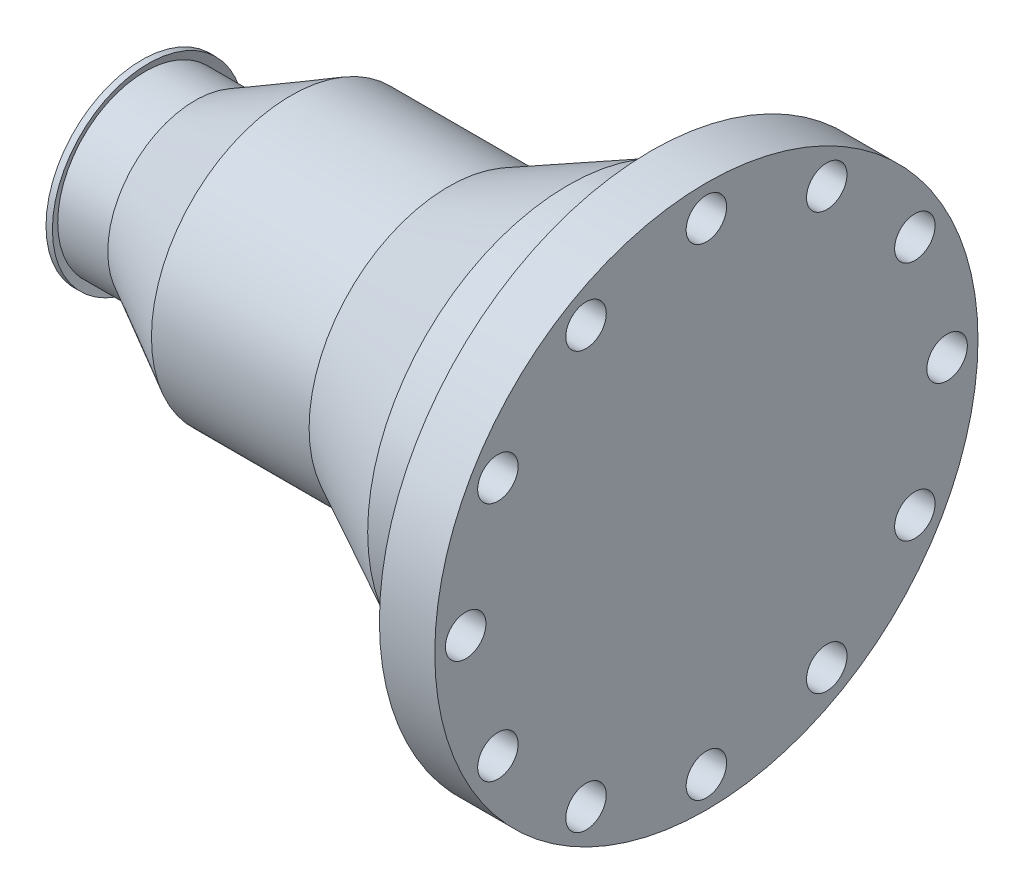
ISO-10303-21;
HEADER;
FILE_DESCRIPTION(('STEP AP214'),'2;1');
FILE_NAME('part.step','',(''),(''),'','','');
FILE_SCHEMA(('AUTOMOTIVE_DESIGN { 1 0 10303 214 1 1 1 1 }'));
ENDSEC;
DATA;
#1=APPLICATION_CONTEXT('core data for automotive mechanical design processes');
#2=APPLICATION_PROTOCOL_DEFINITION('international standard','automotive_design',2000,#1);
#3=PRODUCT_CONTEXT('',#1,'mechanical');
#4=PRODUCT('Part','Part','',(#3));
#5=PRODUCT_RELATED_PRODUCT_CATEGORY('part','',(#4));
#6=PRODUCT_DEFINITION_FORMATION('','',#4);
#7=PRODUCT_DEFINITION_CONTEXT('part definition',#1,'design');
#8=PRODUCT_DEFINITION('design','',#6,#7);
#9=PRODUCT_DEFINITION_SHAPE('','',#8);
#10=(LENGTH_UNIT() NAMED_UNIT(*) SI_UNIT(.MILLI.,.METRE.));
#11=(NAMED_UNIT(*) PLANE_ANGLE_UNIT() SI_UNIT($,.RADIAN.));
#12=(NAMED_UNIT(*) SI_UNIT($,.STERADIAN.) SOLID_ANGLE_UNIT());
#13=UNCERTAINTY_MEASURE_WITH_UNIT(LENGTH_MEASURE(1.E-05),#10,'distance_accuracy_value','');
#14=(GEOMETRIC_REPRESENTATION_CONTEXT(3) GLOBAL_UNCERTAINTY_ASSIGNED_CONTEXT((#13)) GLOBAL_UNIT_ASSIGNED_CONTEXT((#10,
#11,#12)) REPRESENTATION_CONTEXT('',''));
#15=CARTESIAN_POINT('',(0.,0.,0.));
#16=DIRECTION('',(0.,0.,1.));
#17=DIRECTION('',(1.,0.,0.));
#18=AXIS2_PLACEMENT_3D('',#15,#16,#17);
#19=CARTESIAN_POINT('',(0.,0.,0.));
#20=DIRECTION('',(1.,0.,0.));
#21=DIRECTION('',(0.,0.,-1.));
#22=AXIS2_PLACEMENT_3D('',#19,#20,#21);
#23=PLANE('',#22);
#24=CARTESIAN_POINT('',(0.,0.,0.));
#25=DIRECTION('',(-1.,0.,0.));
#26=DIRECTION('',(0.,0.,1.));
#27=AXIS2_PLACEMENT_3D('',#24,#25,#26);
#28=CIRCLE('',#27,31.);
#29=CARTESIAN_POINT('',(0.,0.,31.));
#30=VERTEX_POINT('',#29);
#31=EDGE_CURVE('E80',#30,#30,#28,.T.);
#32=ORIENTED_EDGE('',*,*,#31,.F.);
#33=EDGE_LOOP('',(#32));
#34=FACE_BOUND('',#33,.T.);
#35=CARTESIAN_POINT('',(0.,0.,0.));
#36=DIRECTION('',(-1.,0.,0.));
#37=DIRECTION('',(0.,0.,1.));
#38=AXIS2_PLACEMENT_3D('',#35,#36,#37);
#39=CIRCLE('',#38,45.);
#40=CARTESIAN_POINT('',(0.,0.,45.));
#41=VERTEX_POINT('',#40);
#42=EDGE_CURVE('E10',#41,#41,#39,.T.);
#43=ORIENTED_EDGE('',*,*,#42,.T.);
#44=EDGE_LOOP('',(#43));
#45=FACE_BOUND('',#44,.T.);
#46=ADVANCED_FACE('F37',(#34,#45),#23,.F.);
#47=CARTESIAN_POINT('',(0.,0.,0.));
#48=DIRECTION('',(-1.,0.,0.));
#49=DIRECTION('',(0.,0.,1.));
#50=AXIS2_PLACEMENT_3D('',#47,#48,#49);
#51=CYLINDRICAL_SURFACE('',#50,45.);
#52=ORIENTED_EDGE('',*,*,#42,.F.);
#53=EDGE_LOOP('',(#52));
#54=FACE_BOUND('',#53,.T.);
#55=CARTESIAN_POINT('',(3.,0.,0.));
#56=DIRECTION('',(-1.,0.,0.));
#57=DIRECTION('',(0.,0.,1.));
#58=AXIS2_PLACEMENT_3D('',#55,#56,#57);
#59=CIRCLE('',#58,45.);
#60=CARTESIAN_POINT('',(3.,0.,45.));
#61=VERTEX_POINT('',#60);
#62=EDGE_CURVE('E43',#61,#61,#59,.T.);
#63=ORIENTED_EDGE('',*,*,#62,.T.);
#64=EDGE_LOOP('',(#63));
#65=FACE_BOUND('',#64,.T.);
#66=ADVANCED_FACE('F214',(#54,#65),#51,.T.);
#67=CARTESIAN_POINT('',(1.5,0.,0.));
#68=DIRECTION('',(1.,0.,0.));
#69=DIRECTION('',(0.,0.,-1.));
#70=AXIS2_PLACEMENT_3D('',#67,#68,#69);
#71=CONICAL_SURFACE('',#70,41.,1.21202565652432);
#72=ORIENTED_EDGE('',*,*,#62,.F.);
#73=EDGE_LOOP('',(#72));
#74=FACE_BOUND('',#73,.T.);
#75=CARTESIAN_POINT('',(1.5,0.,0.));
#76=DIRECTION('',(-1.,0.,0.));
#77=DIRECTION('',(0.,0.,1.));
#78=AXIS2_PLACEMENT_3D('',#75,#76,#77);
#79=CIRCLE('',#78,41.);
#80=CARTESIAN_POINT('',(1.5,0.,41.));
#81=VERTEX_POINT('',#80);
#82=EDGE_CURVE('E47',#81,#81,#79,.T.);
#83=ORIENTED_EDGE('',*,*,#82,.T.);
#84=EDGE_LOOP('',(#83));
#85=FACE_BOUND('',#84,.T.);
#86=ADVANCED_FACE('F220',(#74,#85),#71,.F.);
#87=CARTESIAN_POINT('',(0.,0.,0.));
#88=DIRECTION('',(-1.,0.,0.));
#89=DIRECTION('',(0.,0.,1.));
#90=AXIS2_PLACEMENT_3D('',#87,#88,#89);
#91=CYLINDRICAL_SURFACE('',#90,41.);
#92=ORIENTED_EDGE('',*,*,#82,.F.);
#93=EDGE_LOOP('',(#92));
#94=FACE_BOUND('',#93,.T.);
#95=CARTESIAN_POINT('',(25.,0.,0.));
#96=DIRECTION('',(-1.,0.,0.));
#97=DIRECTION('',(0.,0.,1.));
#98=AXIS2_PLACEMENT_3D('',#95,#96,#97);
#99=CIRCLE('',#98,41.);
#100=CARTESIAN_POINT('',(25.,0.,41.));
#101=VERTEX_POINT('',#100);
#102=EDGE_CURVE('E51',#101,#101,#99,.T.);
#103=ORIENTED_EDGE('',*,*,#102,.T.);
#104=EDGE_LOOP('',(#103));
#105=FACE_BOUND('',#104,.T.);
#106=ADVANCED_FACE('F457',(#94,#105),#91,.T.);
#107=CARTESIAN_POINT('',(70.,0.,0.));
#108=DIRECTION('',(1.,0.,0.));
#109=DIRECTION('',(0.,0.,-1.));
#110=AXIS2_PLACEMENT_3D('',#107,#108,#109);
#111=CONICAL_SURFACE('',#110,65.5,0.498567905638218);
#112=ORIENTED_EDGE('',*,*,#102,.F.);
#113=EDGE_LOOP('',(#112));
#114=FACE_BOUND('',#113,.T.);
#115=CARTESIAN_POINT('',(70.,0.,0.));
#116=DIRECTION('',(-1.,0.,0.));
#117=DIRECTION('',(0.,0.,1.));
#118=AXIS2_PLACEMENT_3D('',#115,#116,#117);
#119=CIRCLE('',#118,65.5);
#120=CARTESIAN_POINT('',(70.,0.,65.5));
#121=VERTEX_POINT('',#120);
#122=EDGE_CURVE('E56',#121,#121,#119,.T.);
#123=ORIENTED_EDGE('',*,*,#122,.T.);
#124=EDGE_LOOP('',(#123));
#125=FACE_BOUND('',#124,.T.);
#126=ADVANCED_FACE('F448',(#114,#125),#111,.T.);
#127=CARTESIAN_POINT('',(0.,0.,0.));
#128=DIRECTION('',(-1.,0.,0.));
#129=DIRECTION('',(0.,0.,1.));
#130=AXIS2_PLACEMENT_3D('',#127,#128,#129);
#131=CYLINDRICAL_SURFACE('',#130,65.5);
#132=ORIENTED_EDGE('',*,*,#122,.F.);
#133=EDGE_LOOP('',(#132));
#134=FACE_BOUND('',#133,.T.);
#135=CARTESIAN_POINT('',(144.,0.,0.));
#136=DIRECTION('',(-1.,0.,0.));
#137=DIRECTION('',(0.,0.,1.));
#138=AXIS2_PLACEMENT_3D('',#135,#136,#137);
#139=CIRCLE('',#138,65.5);
#140=CARTESIAN_POINT('',(144.,0.,65.5));
#141=VERTEX_POINT('',#140);
#142=EDGE_CURVE('E59',#141,#141,#139,.T.);
#143=ORIENTED_EDGE('',*,*,#142,.T.);
#144=EDGE_LOOP('',(#143));
#145=FACE_BOUND('',#144,.T.);
#146=ADVANCED_FACE('F439',(#134,#145),#131,.T.);
#147=CARTESIAN_POINT('',(200.,0.,0.));
#148=DIRECTION('',(1.,0.,0.));
#149=DIRECTION('',(0.,0.,-1.));
#150=AXIS2_PLACEMENT_3D('',#147,#148,#149);
#151=CONICAL_SURFACE('',#150,94.,0.470764926542016);
#152=ORIENTED_EDGE('',*,*,#142,.F.);
#153=EDGE_LOOP('',(#152));
#154=FACE_BOUND('',#153,.T.);
#155=CARTESIAN_POINT('',(200.,0.,0.));
#156=DIRECTION('',(-1.,0.,0.));
#157=DIRECTION('',(0.,0.,1.));
#158=AXIS2_PLACEMENT_3D('',#155,#156,#157);
#159=CIRCLE('',#158,94.);
#160=CARTESIAN_POINT('',(200.,0.,94.));
#161=VERTEX_POINT('',#160);
#162=EDGE_CURVE('E62',#161,#161,#159,.T.);
#163=ORIENTED_EDGE('',*,*,#162,.T.);
#164=EDGE_LOOP('',(#163));
#165=FACE_BOUND('',#164,.T.);
#166=ADVANCED_FACE('F430',(#154,#165),#151,.T.);
#167=CARTESIAN_POINT('',(0.,0.,0.));
#168=DIRECTION('',(-1.,0.,0.));
#169=DIRECTION('',(0.,0.,1.));
#170=AXIS2_PLACEMENT_3D('',#167,#168,#169);
#171=CYLINDRICAL_SURFACE('',#170,94.);
#172=ORIENTED_EDGE('',*,*,#162,.F.);
#173=EDGE_LOOP('',(#172));
#174=FACE_BOUND('',#173,.T.);
#175=CARTESIAN_POINT('',(220.,0.,0.));
#176=DIRECTION('',(-1.,0.,0.));
#177=DIRECTION('',(0.,0.,1.));
#178=AXIS2_PLACEMENT_3D('',#175,#176,#177);
#179=CIRCLE('',#178,94.);
#180=CARTESIAN_POINT('',(220.,0.,94.));
#181=VERTEX_POINT('',#180);
#182=EDGE_CURVE('E65',#181,#181,#179,.T.);
#183=ORIENTED_EDGE('',*,*,#182,.T.);
#184=EDGE_LOOP('',(#183));
#185=FACE_BOUND('',#184,.T.);
#186=ADVANCED_FACE('F421',(#174,#185),#171,.T.);
#187=CARTESIAN_POINT('',(220.,94.,0.));
#188=DIRECTION('',(1.,0.,0.));
#189=DIRECTION('',(0.,0.,-1.));
#190=AXIS2_PLACEMENT_3D('',#187,#188,#189);
#191=PLANE('',#190);
#192=ORIENTED_EDGE('',*,*,#182,.F.);
#193=EDGE_LOOP('',(#192));
#194=FACE_BOUND('',#193,.T.);
#195=CARTESIAN_POINT('',(220.,0.,0.));
#196=DIRECTION('',(-1.,0.,0.));
#197=DIRECTION('',(0.,0.,1.));
#198=AXIS2_PLACEMENT_3D('',#195,#196,#197);
#199=CIRCLE('',#198,95.);
#200=CARTESIAN_POINT('',(220.,0.,95.));
#201=VERTEX_POINT('',#200);
#202=EDGE_CURVE('E68',#201,#201,#199,.T.);
#203=ORIENTED_EDGE('',*,*,#202,.T.);
#204=EDGE_LOOP('',(#203));
#205=FACE_BOUND('',#204,.T.);
#206=ADVANCED_FACE('F412',(#194,#205),#191,.F.);
#207=CARTESIAN_POINT('',(0.,0.,0.));
#208=DIRECTION('',(-1.,0.,0.));
#209=DIRECTION('',(0.,0.,1.));
#210=AXIS2_PLACEMENT_3D('',#207,#208,#209);
#211=CYLINDRICAL_SURFACE('',#210,95.);
#212=ORIENTED_EDGE('',*,*,#202,.F.);
#213=EDGE_LOOP('',(#212));
#214=FACE_BOUND('',#213,.T.);
#215=CARTESIAN_POINT('',(239.,0.,0.));
#216=DIRECTION('',(-1.,0.,0.));
#217=DIRECTION('',(0.,0.,1.));
#218=AXIS2_PLACEMENT_3D('',#215,#216,#217);
#219=CIRCLE('',#218,95.);
#220=CARTESIAN_POINT('',(239.,0.,95.));
#221=VERTEX_POINT('',#220);
#222=EDGE_CURVE('E71',#221,#221,#219,.T.);
#223=ORIENTED_EDGE('',*,*,#222,.T.);
#224=EDGE_LOOP('',(#223));
#225=FACE_BOUND('',#224,.T.);
#226=ADVANCED_FACE('F210',(#214,#225),#211,.T.);
#227=CARTESIAN_POINT('',(239.,100.,0.));
#228=DIRECTION('',(1.,0.,0.));
#229=DIRECTION('',(0.,0.,-1.));
#230=AXIS2_PLACEMENT_3D('',#227,#228,#229);
#231=PLANE('',#230);
#232=CARTESIAN_POINT('',(239.,97.8608706276416,-56.5));
#233=DIRECTION('',(1.,0.,0.));
#234=DIRECTION('',(0.,0.,-1.));
#235=AXIS2_PLACEMENT_3D('',#232,#233,#234);
#236=CIRCLE('',#235,9.50000000000001);
#237=CARTESIAN_POINT('',(239.,97.8608706276416,-66.));
#238=VERTEX_POINT('',#237);
#239=EDGE_CURVE('E161',#238,#238,#236,.F.);
#240=ORIENTED_EDGE('',*,*,#239,.F.);
#241=EDGE_LOOP('',(#240));
#242=FACE_BOUND('',#241,.T.);
#243=CARTESIAN_POINT('',(239.,56.4999999999999,-97.8608706276416));
#244=DIRECTION('',(1.,0.,0.));
#245=DIRECTION('',(0.,0.,-1.));
#246=AXIS2_PLACEMENT_3D('',#243,#244,#245);
#247=CIRCLE('',#246,9.5);
#248=CARTESIAN_POINT('',(239.,56.4999999999999,-107.360870627642));
#249=VERTEX_POINT('',#248);
#250=EDGE_CURVE('E155',#249,#249,#247,.F.);
#251=ORIENTED_EDGE('',*,*,#250,.F.);
#252=EDGE_LOOP('',(#251));
#253=FACE_BOUND('',#252,.T.);
#254=CARTESIAN_POINT('',(239.,0.,-113.));
#255=DIRECTION('',(1.,0.,0.));
#256=DIRECTION('',(0.,0.,-1.));
#257=AXIS2_PLACEMENT_3D('',#254,#255,#256);
#258=CIRCLE('',#257,9.49999999999999);
#259=CARTESIAN_POINT('',(239.,0.,-122.5));
#260=VERTEX_POINT('',#259);
#261=EDGE_CURVE('E149',#260,#260,#258,.F.);
#262=ORIENTED_EDGE('',*,*,#261,.F.);
#263=EDGE_LOOP('',(#262));
#264=FACE_BOUND('',#263,.T.);
#265=CARTESIAN_POINT('',(239.,-56.5,-97.8608706276415));
#266=DIRECTION('',(1.,0.,0.));
#267=DIRECTION('',(0.,0.,-1.));
#268=AXIS2_PLACEMENT_3D('',#265,#266,#267);
#269=CIRCLE('',#268,9.5);
#270=CARTESIAN_POINT('',(239.,-56.5,-107.360870627642));
#271=VERTEX_POINT('',#270);
#272=EDGE_CURVE('E143',#271,#271,#269,.F.);
#273=ORIENTED_EDGE('',*,*,#272,.F.);
#274=EDGE_LOOP('',(#273));
#275=FACE_BOUND('',#274,.T.);
#276=CARTESIAN_POINT('',(239.,-97.8608706276416,-56.5));
#277=DIRECTION('',(1.,0.,0.));
#278=DIRECTION('',(0.,0.,-1.));
#279=AXIS2_PLACEMENT_3D('',#276,#277,#278);
#280=CIRCLE('',#279,9.50000000000001);
#281=CARTESIAN_POINT('',(239.,-97.8608706276416,-66.));
#282=VERTEX_POINT('',#281);
#283=EDGE_CURVE('E137',#282,#282,#280,.F.);
#284=ORIENTED_EDGE('',*,*,#283,.F.);
#285=EDGE_LOOP('',(#284));
#286=FACE_BOUND('',#285,.T.);
#287=CARTESIAN_POINT('',(239.,-113.,0.));
#288=DIRECTION('',(1.,0.,0.));
#289=DIRECTION('',(0.,0.,-1.));
#290=AXIS2_PLACEMENT_3D('',#287,#288,#289);
#291=CIRCLE('',#290,9.49999999999998);
#292=CARTESIAN_POINT('',(239.,-113.,-9.49999999999998));
#293=VERTEX_POINT('',#292);
#294=EDGE_CURVE('E131',#293,#293,#291,.F.);
#295=ORIENTED_EDGE('',*,*,#294,.F.);
#296=EDGE_LOOP('',(#295));
#297=FACE_BOUND('',#296,.T.);
#298=CARTESIAN_POINT('',(239.,-97.8608706276415,56.5));
#299=DIRECTION('',(1.,0.,0.));
#300=DIRECTION('',(0.,0.,-1.));
#301=AXIS2_PLACEMENT_3D('',#298,#299,#300);
#302=CIRCLE('',#301,9.5);
#303=CARTESIAN_POINT('',(239.,-97.8608706276415,47.));
#304=VERTEX_POINT('',#303);
#305=EDGE_CURVE('E125',#304,#304,#302,.F.);
#306=ORIENTED_EDGE('',*,*,#305,.F.);
#307=EDGE_LOOP('',(#306));
#308=FACE_BOUND('',#307,.T.);
#309=CARTESIAN_POINT('',(239.,-56.5,97.8608706276416));
#310=DIRECTION('',(1.,0.,0.));
#311=DIRECTION('',(0.,0.,-1.));
#312=AXIS2_PLACEMENT_3D('',#309,#310,#311);
#313=CIRCLE('',#312,9.5);
#314=CARTESIAN_POINT('',(239.,-56.5,88.3608706276416));
#315=VERTEX_POINT('',#314);
#316=EDGE_CURVE('E119',#315,#315,#313,.F.);
#317=ORIENTED_EDGE('',*,*,#316,.F.);
#318=EDGE_LOOP('',(#317));
#319=FACE_BOUND('',#318,.T.);
#320=CARTESIAN_POINT('',(239.,0.,113.));
#321=DIRECTION('',(1.,0.,0.));
#322=DIRECTION('',(0.,0.,-1.));
#323=AXIS2_PLACEMENT_3D('',#320,#321,#322);
#324=CIRCLE('',#323,9.49999999999999);
#325=CARTESIAN_POINT('',(239.,0.,103.5));
#326=VERTEX_POINT('',#325);
#327=EDGE_CURVE('E113',#326,#326,#324,.F.);
#328=ORIENTED_EDGE('',*,*,#327,.F.);
#329=EDGE_LOOP('',(#328));
#330=FACE_BOUND('',#329,.T.);
#331=CARTESIAN_POINT('',(239.,56.5,97.8608706276416));
#332=DIRECTION('',(1.,0.,0.));
#333=DIRECTION('',(0.,0.,-1.));
#334=AXIS2_PLACEMENT_3D('',#331,#332,#333);
#335=CIRCLE('',#334,9.5);
#336=CARTESIAN_POINT('',(239.,56.5,88.3608706276416));
#337=VERTEX_POINT('',#336);
#338=EDGE_CURVE('E107',#337,#337,#335,.F.);
#339=ORIENTED_EDGE('',*,*,#338,.F.);
#340=EDGE_LOOP('',(#339));
#341=FACE_BOUND('',#340,.T.);
#342=CARTESIAN_POINT('',(239.,97.8608706276416,56.5));
#343=DIRECTION('',(1.,0.,0.));
#344=DIRECTION('',(0.,0.,-1.));
#345=AXIS2_PLACEMENT_3D('',#342,#343,#344);
#346=CIRCLE('',#345,9.5);
#347=CARTESIAN_POINT('',(239.,97.8608706276416,47.));
#348=VERTEX_POINT('',#347);
#349=EDGE_CURVE('E101',#348,#348,#346,.F.);
#350=ORIENTED_EDGE('',*,*,#349,.F.);
#351=EDGE_LOOP('',(#350));
#352=FACE_BOUND('',#351,.T.);
#353=CARTESIAN_POINT('',(239.,113.,0.));
#354=DIRECTION('',(1.,0.,0.));
#355=DIRECTION('',(0.,0.,-1.));
#356=AXIS2_PLACEMENT_3D('',#353,#354,#355);
#357=CIRCLE('',#356,9.50000000000001);
#358=CARTESIAN_POINT('',(239.,113.,-9.50000000000001));
#359=VERTEX_POINT('',#358);
#360=EDGE_CURVE('E95',#359,#359,#357,.F.);
#361=ORIENTED_EDGE('',*,*,#360,.F.);
#362=EDGE_LOOP('',(#361));
#363=FACE_BOUND('',#362,.T.);
#364=ORIENTED_EDGE('',*,*,#222,.F.);
#365=EDGE_LOOP('',(#364));
#366=FACE_BOUND('',#365,.T.);
#367=CARTESIAN_POINT('',(239.,0.,0.));
#368=DIRECTION('',(-1.,0.,0.));
#369=DIRECTION('',(0.,0.,1.));
#370=AXIS2_PLACEMENT_3D('',#367,#368,#369);
#371=CIRCLE('',#370,127.5);
#372=CARTESIAN_POINT('',(239.,0.,127.5));
#373=VERTEX_POINT('',#372);
#374=EDGE_CURVE('E74',#373,#373,#371,.T.);
#375=ORIENTED_EDGE('',*,*,#374,.T.);
#376=EDGE_LOOP('',(#375));
#377=FACE_BOUND('',#376,.T.);
#378=ADVANCED_FACE('F202',(#242,#253,#264,#275,#286,#297,#308,#319,#330,#341,#352,#363,#366,
#377),#231,.F.);
#379=CARTESIAN_POINT('',(0.,0.,0.));
#380=DIRECTION('',(-1.,0.,0.));
#381=DIRECTION('',(0.,0.,1.));
#382=AXIS2_PLACEMENT_3D('',#379,#380,#381);
#383=CYLINDRICAL_SURFACE('',#382,127.5);
#384=ORIENTED_EDGE('',*,*,#374,.F.);
#385=EDGE_LOOP('',(#384));
#386=FACE_BOUND('',#385,.T.);
#387=CARTESIAN_POINT('',(265.,0.,0.));
#388=DIRECTION('',(-1.,0.,0.));
#389=DIRECTION('',(0.,0.,1.));
#390=AXIS2_PLACEMENT_3D('',#387,#388,#389);
#391=CIRCLE('',#390,127.5);
#392=CARTESIAN_POINT('',(265.,0.,127.5));
#393=VERTEX_POINT('',#392);
#394=EDGE_CURVE('E77',#393,#393,#391,.T.);
#395=ORIENTED_EDGE('',*,*,#394,.T.);
#396=EDGE_LOOP('',(#395));
#397=FACE_BOUND('',#396,.T.);
#398=ADVANCED_FACE('F175',(#386,#397),#383,.T.);
#399=CARTESIAN_POINT('',(265.,127.5,0.));
#400=DIRECTION('',(-1.,0.,0.));
#401=DIRECTION('',(0.,0.,1.));
#402=AXIS2_PLACEMENT_3D('',#399,#400,#401);
#403=PLANE('',#402);
#404=CARTESIAN_POINT('',(265.,97.8608706276416,-56.5));
#405=DIRECTION('',(1.,0.,0.));
#406=DIRECTION('',(0.,0.,-1.));
#407=AXIS2_PLACEMENT_3D('',#404,#405,#406);
#408=CIRCLE('',#407,9.50000000000001);
#409=CARTESIAN_POINT('',(265.,97.8608706276416,-66.));
#410=VERTEX_POINT('',#409);
#411=EDGE_CURVE('E164',#410,#410,#408,.T.);
#412=ORIENTED_EDGE('',*,*,#411,.F.);
#413=EDGE_LOOP('',(#412));
#414=FACE_BOUND('',#413,.T.);
#415=CARTESIAN_POINT('',(265.,56.4999999999999,-97.8608706276416));
#416=DIRECTION('',(1.,0.,0.));
#417=DIRECTION('',(0.,0.,-1.));
#418=AXIS2_PLACEMENT_3D('',#415,#416,#417);
#419=CIRCLE('',#418,9.5);
#420=CARTESIAN_POINT('',(265.,56.4999999999999,-107.360870627642));
#421=VERTEX_POINT('',#420);
#422=EDGE_CURVE('E158',#421,#421,#419,.T.);
#423=ORIENTED_EDGE('',*,*,#422,.F.);
#424=EDGE_LOOP('',(#423));
#425=FACE_BOUND('',#424,.T.);
#426=CARTESIAN_POINT('',(265.,0.,-113.));
#427=DIRECTION('',(1.,0.,0.));
#428=DIRECTION('',(0.,0.,-1.));
#429=AXIS2_PLACEMENT_3D('',#426,#427,#428);
#430=CIRCLE('',#429,9.49999999999999);
#431=CARTESIAN_POINT('',(265.,0.,-122.5));
#432=VERTEX_POINT('',#431);
#433=EDGE_CURVE('E152',#432,#432,#430,.T.);
#434=ORIENTED_EDGE('',*,*,#433,.F.);
#435=EDGE_LOOP('',(#434));
#436=FACE_BOUND('',#435,.T.);
#437=CARTESIAN_POINT('',(265.,-56.5,-97.8608706276415));
#438=DIRECTION('',(1.,0.,0.));
#439=DIRECTION('',(0.,0.,-1.));
#440=AXIS2_PLACEMENT_3D('',#437,#438,#439);
#441=CIRCLE('',#440,9.5);
#442=CARTESIAN_POINT('',(265.,-56.5,-107.360870627642));
#443=VERTEX_POINT('',#442);
#444=EDGE_CURVE('E146',#443,#443,#441,.T.);
#445=ORIENTED_EDGE('',*,*,#444,.F.);
#446=EDGE_LOOP('',(#445));
#447=FACE_BOUND('',#446,.T.);
#448=CARTESIAN_POINT('',(265.,-97.8608706276416,-56.5));
#449=DIRECTION('',(1.,0.,0.));
#450=DIRECTION('',(0.,0.,-1.));
#451=AXIS2_PLACEMENT_3D('',#448,#449,#450);
#452=CIRCLE('',#451,9.50000000000001);
#453=CARTESIAN_POINT('',(265.,-97.8608706276416,-66.));
#454=VERTEX_POINT('',#453);
#455=EDGE_CURVE('E140',#454,#454,#452,.T.);
#456=ORIENTED_EDGE('',*,*,#455,.F.);
#457=EDGE_LOOP('',(#456));
#458=FACE_BOUND('',#457,.T.);
#459=CARTESIAN_POINT('',(265.,-113.,0.));
#460=DIRECTION('',(1.,0.,0.));
#461=DIRECTION('',(0.,0.,-1.));
#462=AXIS2_PLACEMENT_3D('',#459,#460,#461);
#463=CIRCLE('',#462,9.49999999999998);
#464=CARTESIAN_POINT('',(265.,-113.,-9.49999999999998));
#465=VERTEX_POINT('',#464);
#466=EDGE_CURVE('E134',#465,#465,#463,.T.);
#467=ORIENTED_EDGE('',*,*,#466,.F.);
#468=EDGE_LOOP('',(#467));
#469=FACE_BOUND('',#468,.T.);
#470=CARTESIAN_POINT('',(265.,-97.8608706276415,56.5));
#471=DIRECTION('',(1.,0.,0.));
#472=DIRECTION('',(0.,0.,-1.));
#473=AXIS2_PLACEMENT_3D('',#470,#471,#472);
#474=CIRCLE('',#473,9.5);
#475=CARTESIAN_POINT('',(265.,-97.8608706276415,47.));
#476=VERTEX_POINT('',#475);
#477=EDGE_CURVE('E128',#476,#476,#474,.T.);
#478=ORIENTED_EDGE('',*,*,#477,.F.);
#479=EDGE_LOOP('',(#478));
#480=FACE_BOUND('',#479,.T.);
#481=CARTESIAN_POINT('',(265.,-56.5,97.8608706276416));
#482=DIRECTION('',(1.,0.,0.));
#483=DIRECTION('',(0.,0.,-1.));
#484=AXIS2_PLACEMENT_3D('',#481,#482,#483);
#485=CIRCLE('',#484,9.5);
#486=CARTESIAN_POINT('',(265.,-56.5,88.3608706276416));
#487=VERTEX_POINT('',#486);
#488=EDGE_CURVE('E122',#487,#487,#485,.T.);
#489=ORIENTED_EDGE('',*,*,#488,.F.);
#490=EDGE_LOOP('',(#489));
#491=FACE_BOUND('',#490,.T.);
#492=CARTESIAN_POINT('',(265.,0.,113.));
#493=DIRECTION('',(1.,0.,0.));
#494=DIRECTION('',(0.,0.,-1.));
#495=AXIS2_PLACEMENT_3D('',#492,#493,#494);
#496=CIRCLE('',#495,9.49999999999999);
#497=CARTESIAN_POINT('',(265.,0.,103.5));
#498=VERTEX_POINT('',#497);
#499=EDGE_CURVE('E116',#498,#498,#496,.T.);
#500=ORIENTED_EDGE('',*,*,#499,.F.);
#501=EDGE_LOOP('',(#500));
#502=FACE_BOUND('',#501,.T.);
#503=CARTESIAN_POINT('',(265.,56.5,97.8608706276416));
#504=DIRECTION('',(1.,0.,0.));
#505=DIRECTION('',(0.,0.,-1.));
#506=AXIS2_PLACEMENT_3D('',#503,#504,#505);
#507=CIRCLE('',#506,9.5);
#508=CARTESIAN_POINT('',(265.,56.5,88.3608706276416));
#509=VERTEX_POINT('',#508);
#510=EDGE_CURVE('E110',#509,#509,#507,.T.);
#511=ORIENTED_EDGE('',*,*,#510,.F.);
#512=EDGE_LOOP('',(#511));
#513=FACE_BOUND('',#512,.T.);
#514=CARTESIAN_POINT('',(265.,97.8608706276416,56.5));
#515=DIRECTION('',(1.,0.,0.));
#516=DIRECTION('',(0.,0.,-1.));
#517=AXIS2_PLACEMENT_3D('',#514,#515,#516);
#518=CIRCLE('',#517,9.5);
#519=CARTESIAN_POINT('',(265.,97.8608706276416,47.));
#520=VERTEX_POINT('',#519);
#521=EDGE_CURVE('E104',#520,#520,#518,.T.);
#522=ORIENTED_EDGE('',*,*,#521,.F.);
#523=EDGE_LOOP('',(#522));
#524=FACE_BOUND('',#523,.T.);
#525=CARTESIAN_POINT('',(265.,113.,0.));
#526=DIRECTION('',(1.,0.,0.));
#527=DIRECTION('',(0.,0.,-1.));
#528=AXIS2_PLACEMENT_3D('',#525,#526,#527);
#529=CIRCLE('',#528,9.50000000000001);
#530=CARTESIAN_POINT('',(265.,113.,-9.50000000000001));
#531=VERTEX_POINT('',#530);
#532=EDGE_CURVE('E98',#531,#531,#529,.T.);
#533=ORIENTED_EDGE('',*,*,#532,.F.);
#534=EDGE_LOOP('',(#533));
#535=FACE_BOUND('',#534,.T.);
#536=ORIENTED_EDGE('',*,*,#394,.F.);
#537=EDGE_LOOP('',(#536));
#538=FACE_BOUND('',#537,.T.);
#539=ADVANCED_FACE('F171',(#414,#425,#436,#447,#458,#469,#480,#491,#502,#513,#524,#535,#538),
#403,.F.);
#540=CARTESIAN_POINT('',(0.,0.,0.));
#541=DIRECTION('',(-1.,0.,0.));
#542=DIRECTION('',(0.,0.,1.));
#543=AXIS2_PLACEMENT_3D('',#540,#541,#542);
#544=CYLINDRICAL_SURFACE('',#543,31.);
#545=ORIENTED_EDGE('',*,*,#31,.T.);
#546=EDGE_LOOP('',(#545));
#547=FACE_BOUND('',#546,.T.);
#548=CARTESIAN_POINT('',(42.,0.,0.));
#549=DIRECTION('',(-1.,0.,0.));
#550=DIRECTION('',(0.,0.,1.));
#551=AXIS2_PLACEMENT_3D('',#548,#549,#550);
#552=CIRCLE('',#551,31.);
#553=CARTESIAN_POINT('',(42.,0.,31.));
#554=VERTEX_POINT('',#553);
#555=EDGE_CURVE('E83',#554,#554,#552,.T.);
#556=ORIENTED_EDGE('',*,*,#555,.F.);
#557=EDGE_LOOP('',(#556));
#558=FACE_BOUND('',#557,.T.);
#559=ADVANCED_FACE('F174',(#547,#558),#544,.F.);
#560=CARTESIAN_POINT('',(115.8903839302,0.,0.));
#561=DIRECTION('',(1.,0.,0.));
#562=DIRECTION('',(0.,0.,-1.));
#563=AXIS2_PLACEMENT_3D('',#560,#561,#562);
#564=CONICAL_SURFACE('',#563,50.7962913145,0.261766842877817);
#565=ORIENTED_EDGE('',*,*,#555,.T.);
#566=EDGE_LOOP('',(#565));
#567=FACE_BOUND('',#566,.T.);
#568=CARTESIAN_POINT('',(115.8903839302,0.,0.));
#569=DIRECTION('',(-1.,0.,0.));
#570=DIRECTION('',(0.,0.,1.));
#571=AXIS2_PLACEMENT_3D('',#568,#569,#570);
#572=CIRCLE('',#571,50.7962913145);
#573=CARTESIAN_POINT('',(115.8903839302,50.7962913145,0.));
#574=VERTEX_POINT('',#573);
#575=EDGE_CURVE('E86',#574,#574,#572,.T.);
#576=ORIENTED_EDGE('',*,*,#575,.F.);
#577=EDGE_LOOP('',(#576));
#578=FACE_BOUND('',#577,.T.);
#579=ADVANCED_FACE('F225',(#567,#578),#564,.F.);
#580=CARTESIAN_POINT('',(129.49943732892,0.,0.));
#581=DIRECTION('',(-1.,0.,0.));
#582=DIRECTION('',(0.,1.,0.));
#583=AXIS2_PLACEMENT_3D('',#580,#581,#582);
#584=SPHERICAL_SURFACE('',#583,52.5877318936344);
#585=CARTESIAN_POINT('',(128.830273913803,0.,0.));
#586=DIRECTION('',(-1.,0.,0.));
#587=DIRECTION('',(0.,0.,1.));
#588=AXIS2_PLACEMENT_3D('',#585,#586,#587);
#589=CIRCLE('',#588,52.5834742674982);
#590=CARTESIAN_POINT('',(128.830273913803,52.5834742674982,0.));
#591=VERTEX_POINT('',#590);
#592=EDGE_CURVE('E89',#591,#591,#589,.T.);
#593=CARTESIAN_POINT('',(115.8903839302,50.7962913145,0.));
#594=CARTESIAN_POINT('',(116.022158922109,50.8315957326435,0.));
#595=CARTESIAN_POINT('',(116.154071299,50.8663873556991,0.));
#596=CARTESIAN_POINT('',(116.41816282035,50.9349429534695,0.));
#597=CARTESIAN_POINT('',(116.550341964808,50.9687069281841,0.));
#598=CARTESIAN_POINT('',(116.814959018899,51.0352051711067,0.));
#599=CARTESIAN_POINT('',(116.947396928531,51.0679394393148,0.));
#600=CARTESIAN_POINT('',(117.212523490569,51.1323762901037,0.));
#601=CARTESIAN_POINT('',(117.345212142977,51.1640788726846,0.));
#602=CARTESIAN_POINT('',(117.610832154142,51.2264504311169,0.));
#603=CARTESIAN_POINT('',(117.743763512901,51.2571194069683,0.));
#604=CARTESIAN_POINT('',(118.009860885333,51.3174218946399,0.));
#605=CARTESIAN_POINT('',(118.143026899007,51.3470554064602,0.));
#606=CARTESIAN_POINT('',(118.409585515707,51.4052851711631,0.));
#607=CARTESIAN_POINT('',(118.542978118732,51.4338814240457,0.));
#608=CARTESIAN_POINT('',(118.809981834824,51.4900349388771,0.));
#609=CARTESIAN_POINT('',(118.943592947889,51.517592200826,0.));
#610=CARTESIAN_POINT('',(119.211025591522,51.5716660647003,0.));
#611=CARTESIAN_POINT('',(119.344847122088,51.5981826666259,0.));
#612=CARTESIAN_POINT('',(119.612692495435,51.6501736044007,0.));
#613=CARTESIAN_POINT('',(119.746716338217,51.67564794025,0.));
#614=CARTESIAN_POINT('',(120.014958218455,51.7255528029457,0.));
#615=CARTESIAN_POINT('',(120.149176255912,51.7499833297921,0.));
#616=CARTESIAN_POINT('',(120.4177983962,51.797799094777,0.));
#617=CARTESIAN_POINT('',(120.552202499032,51.8211843329156,0.));
#618=CARTESIAN_POINT('',(120.8211886295,51.8669081040906,0.));
#619=CARTESIAN_POINT('',(120.955770657136,51.8892466371272,0.));
#620=CARTESIAN_POINT('',(121.225104485864,51.9328756451008,0.));
#621=CARTESIAN_POINT('',(121.359856286957,51.9541661200379,0.));
#622=CARTESIAN_POINT('',(121.629521500969,51.9956977222938,0.));
#623=CARTESIAN_POINT('',(121.764434913889,52.0159388496127,0.));
#624=CARTESIAN_POINT('',(122.034415180137,52.0553705306701,0.));
#625=CARTESIAN_POINT('',(122.169482033466,52.0745610844087,0.));
#626=CARTESIAN_POINT('',(122.439760999819,52.1118904559746,0.));
#627=CARTESIAN_POINT('',(122.574973112843,52.130029273802,0.));
#628=CARTESIAN_POINT('',(122.845534409079,52.1652540749157,0.));
#629=CARTESIAN_POINT('',(122.98088359229,52.1823400582021,0.));
#630=CARTESIAN_POINT('',(123.251710831087,52.2154581553725,0.));
#631=CARTESIAN_POINT('',(123.387188886673,52.2314902692563,0.));
#632=CARTESIAN_POINT('',(123.6582656646,52.2624996565905,0.));
#633=CARTESIAN_POINT('',(123.793864386942,52.2774769300408,0.));
#634=CARTESIAN_POINT('',(124.065174285457,52.3063757293661,0.));
#635=CARTESIAN_POINT('',(124.200885461629,52.3202972552412,0.));
#636=CARTESIAN_POINT('',(124.472412048067,52.347083716219,0.));
#637=CARTESIAN_POINT('',(124.608227458332,52.3599486513217,0.));
#638=CARTESIAN_POINT('',(124.879954286906,52.3846211515529,0.));
#639=CARTESIAN_POINT('',(125.015865705214,52.3964287166813,0.));
#640=CARTESIAN_POINT('',(125.287776318008,52.4189857618053,0.));
#641=CARTESIAN_POINT('',(125.423775512493,52.4297352418008,0.));
#642=CARTESIAN_POINT('',(125.695853440458,52.4501754655843,0.));
#643=CARTESIAN_POINT('',(125.831932173939,52.4598662093723,0.));
#644=CARTESIAN_POINT('',(126.104160937895,52.4781883737982,0.));
#645=CARTESIAN_POINT('',(126.240310968371,52.486819794436,0.));
#646=CARTESIAN_POINT('',(126.512674080001,52.503022789756,0.));
#647=CARTESIAN_POINT('',(126.648887161155,52.5105943644381,0.));
#648=CARTESIAN_POINT('',(126.921368124004,52.5246772093225,0.));
#649=CARTESIAN_POINT('',(127.057636005698,52.5311884795247,0.));
#650=CARTESIAN_POINT('',(127.330218316177,52.5431503208142,0.));
#651=CARTESIAN_POINT('',(127.466532744961,52.5486008919014,0.));
#652=CARTESIAN_POINT('',(127.739199893324,52.5584410058067,0.));
#653=CARTESIAN_POINT('',(127.875552612903,52.5628305486249,0.));
#654=CARTESIAN_POINT('',(128.148288084336,52.5705483364864,0.));
#655=CARTESIAN_POINT('',(128.284670836191,52.5738765815297,0.));
#656=CARTESIAN_POINT('',(128.557458111482,52.5794715858433,0.));
#657=CARTESIAN_POINT('',(128.69386263492,52.5817383451135,0.));
#658=CARTESIAN_POINT('',(128.830273913803,52.5834742674982,0.));
#659=B_SPLINE_CURVE_WITH_KNOTS('',3,(#593,#594,#595,#596,#597,#598,#599,#600,#601,#602,#603,
#604,#605,#606,#607,#608,#609,#610,#611,#612,#613,#614,#615,#616,#617,#618,#619,#620,#621,#622,
#623,#624,#625,#626,#627,#628,#629,#630,#631,#632,#633,#634,#635,#636,#637,#638,#639,#640,#641,
#642,#643,#644,#645,#646,#647,#648,#649,#650,#651,#652,#653,#654,#655,#656,#657,#658),
.UNSPECIFIED.,.F.,.F.,(4,2,2,2,2,2,2,2,2,2,2,2,2,2,2,2,2,2,2,2,2,2,2,2,2,2,2,2,2,2,2,2,4),(0.,
0.409265938306404,0.818531876612794,1.2277978149192,1.6370637532256,2.04632969153199,
2.45559562983838,2.86486156814479,3.27412750645117,3.68339344475758,4.09265938306397,
4.50192532137037,4.91119125967676,5.32045719798317,5.72972313628957,6.13898907459596,
6.54825501290235,6.95752095120875,7.36678688951514,7.77605282782155,8.18531876612794,
8.59458470443433,9.00385064274073,9.41311658104713,9.82238251935352,10.2316484576599,
10.6409143959663,11.0501803342727,11.4594462725791,11.8687122108855,12.2779781491919,
12.6872440874983,13.0965100258047),.UNSPECIFIED.);
#660=EDGE_CURVE('BSEAM231',#574,#591,#659,.T.);
#661=ORIENTED_EDGE('',*,*,#575,.T.);
#662=ORIENTED_EDGE('',*,*,#592,.F.);
#663=ORIENTED_EDGE('',*,*,#660,.T.);
#664=ORIENTED_EDGE('',*,*,#660,.F.);
#665=EDGE_LOOP('',(#661,#663,#662,#664));
#666=FACE_BOUND('',#665,.T.);
#667=ADVANCED_FACE('F231',(#666),#584,.F.);
#668=CARTESIAN_POINT('',(0.,0.,0.));
#669=DIRECTION('',(-1.,0.,0.));
#670=DIRECTION('',(0.,0.,1.));
#671=AXIS2_PLACEMENT_3D('',#668,#669,#670);
#672=CYLINDRICAL_SURFACE('',#671,52.5834742674982);
#673=ORIENTED_EDGE('',*,*,#592,.T.);
#674=EDGE_LOOP('',(#673));
#675=FACE_BOUND('',#674,.T.);
#676=CARTESIAN_POINT('',(215.8313361853,0.,0.));
#677=DIRECTION('',(-1.,0.,0.));
#678=DIRECTION('',(0.,0.,1.));
#679=AXIS2_PLACEMENT_3D('',#676,#677,#678);
#680=CIRCLE('',#679,52.5834742674982);
#681=CARTESIAN_POINT('',(215.8313361853,0.,52.5834742674982));
#682=VERTEX_POINT('',#681);
#683=EDGE_CURVE('E92',#682,#682,#680,.T.);
#684=ORIENTED_EDGE('',*,*,#683,.F.);
#685=EDGE_LOOP('',(#684));
#686=FACE_BOUND('',#685,.T.);
#687=ADVANCED_FACE('F237',(#675,#686),#672,.F.);
#688=CARTESIAN_POINT('',(215.8313361853,52.5834742674982,0.));
#689=DIRECTION('',(-1.,0.,0.));
#690=DIRECTION('',(0.,0.,1.));
#691=AXIS2_PLACEMENT_3D('',#688,#689,#690);
#692=PLANE('',#691);
#693=ORIENTED_EDGE('',*,*,#683,.T.);
#694=EDGE_LOOP('',(#693));
#695=FACE_BOUND('',#694,.T.);
#696=ADVANCED_FACE('F243',(#695),#692,.T.);
#697=CARTESIAN_POINT('',(265.,113.,0.));
#698=DIRECTION('',(-1.,0.,0.));
#699=DIRECTION('',(0.,0.,1.));
#700=AXIS2_PLACEMENT_3D('',#697,#698,#699);
#701=CYLINDRICAL_SURFACE('',#700,9.50000000000001);
#702=ORIENTED_EDGE('',*,*,#532,.T.);
#703=EDGE_LOOP('',(#702));
#704=FACE_BOUND('',#703,.T.);
#705=ORIENTED_EDGE('',*,*,#360,.T.);
#706=EDGE_LOOP('',(#705));
#707=FACE_BOUND('',#706,.T.);
#708=ADVANCED_FACE('F248',(#704,#707),#701,.F.);
#709=CARTESIAN_POINT('',(265.,97.8608706276416,56.5));
#710=DIRECTION('',(-1.,0.,0.));
#711=DIRECTION('',(0.,0.,1.));
#712=AXIS2_PLACEMENT_3D('',#709,#710,#711);
#713=CYLINDRICAL_SURFACE('',#712,9.5);
#714=ORIENTED_EDGE('',*,*,#521,.T.);
#715=EDGE_LOOP('',(#714));
#716=FACE_BOUND('',#715,.T.);
#717=ORIENTED_EDGE('',*,*,#349,.T.);
#718=EDGE_LOOP('',(#717));
#719=FACE_BOUND('',#718,.T.);
#720=ADVANCED_FACE('F253',(#716,#719),#713,.F.);
#721=CARTESIAN_POINT('',(265.,56.5,97.8608706276416));
#722=DIRECTION('',(-1.,0.,0.));
#723=DIRECTION('',(0.,0.,1.));
#724=AXIS2_PLACEMENT_3D('',#721,#722,#723);
#725=CYLINDRICAL_SURFACE('',#724,9.5);
#726=ORIENTED_EDGE('',*,*,#510,.T.);
#727=EDGE_LOOP('',(#726));
#728=FACE_BOUND('',#727,.T.);
#729=ORIENTED_EDGE('',*,*,#338,.T.);
#730=EDGE_LOOP('',(#729));
#731=FACE_BOUND('',#730,.T.);
#732=ADVANCED_FACE('F259',(#728,#731),#725,.F.);
#733=CARTESIAN_POINT('',(265.,0.,113.));
#734=DIRECTION('',(-1.,0.,0.));
#735=DIRECTION('',(0.,0.,1.));
#736=AXIS2_PLACEMENT_3D('',#733,#734,#735);
#737=CYLINDRICAL_SURFACE('',#736,9.49999999999999);
#738=ORIENTED_EDGE('',*,*,#499,.T.);
#739=EDGE_LOOP('',(#738));
#740=FACE_BOUND('',#739,.T.);
#741=ORIENTED_EDGE('',*,*,#327,.T.);
#742=EDGE_LOOP('',(#741));
#743=FACE_BOUND('',#742,.T.);
#744=ADVANCED_FACE('F263',(#740,#743),#737,.F.);
#745=CARTESIAN_POINT('',(265.,-56.5,97.8608706276416));
#746=DIRECTION('',(-1.,0.,0.));
#747=DIRECTION('',(0.,0.,1.));
#748=AXIS2_PLACEMENT_3D('',#745,#746,#747);
#749=CYLINDRICAL_SURFACE('',#748,9.5);
#750=ORIENTED_EDGE('',*,*,#488,.T.);
#751=EDGE_LOOP('',(#750));
#752=FACE_BOUND('',#751,.T.);
#753=ORIENTED_EDGE('',*,*,#316,.T.);
#754=EDGE_LOOP('',(#753));
#755=FACE_BOUND('',#754,.T.);
#756=ADVANCED_FACE('F267',(#752,#755),#749,.F.);
#757=CARTESIAN_POINT('',(265.,-97.8608706276415,56.5));
#758=DIRECTION('',(-1.,0.,0.));
#759=DIRECTION('',(0.,0.,1.));
#760=AXIS2_PLACEMENT_3D('',#757,#758,#759);
#761=CYLINDRICAL_SURFACE('',#760,9.5);
#762=ORIENTED_EDGE('',*,*,#477,.T.);
#763=EDGE_LOOP('',(#762));
#764=FACE_BOUND('',#763,.T.);
#765=ORIENTED_EDGE('',*,*,#305,.T.);
#766=EDGE_LOOP('',(#765));
#767=FACE_BOUND('',#766,.T.);
#768=ADVANCED_FACE('F271',(#764,#767),#761,.F.);
#769=CARTESIAN_POINT('',(265.,-113.,0.));
#770=DIRECTION('',(-1.,0.,0.));
#771=DIRECTION('',(0.,0.,1.));
#772=AXIS2_PLACEMENT_3D('',#769,#770,#771);
#773=CYLINDRICAL_SURFACE('',#772,9.49999999999998);
#774=ORIENTED_EDGE('',*,*,#466,.T.);
#775=EDGE_LOOP('',(#774));
#776=FACE_BOUND('',#775,.T.);
#777=ORIENTED_EDGE('',*,*,#294,.T.);
#778=EDGE_LOOP('',(#777));
#779=FACE_BOUND('',#778,.T.);
#780=ADVANCED_FACE('F275',(#776,#779),#773,.F.);
#781=CARTESIAN_POINT('',(265.,-97.8608706276416,-56.5));
#782=DIRECTION('',(-1.,0.,0.));
#783=DIRECTION('',(0.,0.,1.));
#784=AXIS2_PLACEMENT_3D('',#781,#782,#783);
#785=CYLINDRICAL_SURFACE('',#784,9.50000000000001);
#786=ORIENTED_EDGE('',*,*,#455,.T.);
#787=EDGE_LOOP('',(#786));
#788=FACE_BOUND('',#787,.T.);
#789=ORIENTED_EDGE('',*,*,#283,.T.);
#790=EDGE_LOOP('',(#789));
#791=FACE_BOUND('',#790,.T.);
#792=ADVANCED_FACE('F279',(#788,#791),#785,.F.);
#793=CARTESIAN_POINT('',(265.,-56.5,-97.8608706276415));
#794=DIRECTION('',(-1.,0.,0.));
#795=DIRECTION('',(0.,0.,1.));
#796=AXIS2_PLACEMENT_3D('',#793,#794,#795);
#797=CYLINDRICAL_SURFACE('',#796,9.5);
#798=ORIENTED_EDGE('',*,*,#444,.T.);
#799=EDGE_LOOP('',(#798));
#800=FACE_BOUND('',#799,.T.);
#801=ORIENTED_EDGE('',*,*,#272,.T.);
#802=EDGE_LOOP('',(#801));
#803=FACE_BOUND('',#802,.T.);
#804=ADVANCED_FACE('F283',(#800,#803),#797,.F.);
#805=CARTESIAN_POINT('',(265.,0.,-113.));
#806=DIRECTION('',(-1.,0.,0.));
#807=DIRECTION('',(0.,0.,1.));
#808=AXIS2_PLACEMENT_3D('',#805,#806,#807);
#809=CYLINDRICAL_SURFACE('',#808,9.49999999999999);
#810=ORIENTED_EDGE('',*,*,#433,.T.);
#811=EDGE_LOOP('',(#810));
#812=FACE_BOUND('',#811,.T.);
#813=ORIENTED_EDGE('',*,*,#261,.T.);
#814=EDGE_LOOP('',(#813));
#815=FACE_BOUND('',#814,.T.);
#816=ADVANCED_FACE('F287',(#812,#815),#809,.F.);
#817=CARTESIAN_POINT('',(265.,56.4999999999999,-97.8608706276416));
#818=DIRECTION('',(-1.,0.,0.));
#819=DIRECTION('',(0.,0.,1.));
#820=AXIS2_PLACEMENT_3D('',#817,#818,#819);
#821=CYLINDRICAL_SURFACE('',#820,9.5);
#822=ORIENTED_EDGE('',*,*,#422,.T.);
#823=EDGE_LOOP('',(#822));
#824=FACE_BOUND('',#823,.T.);
#825=ORIENTED_EDGE('',*,*,#250,.T.);
#826=EDGE_LOOP('',(#825));
#827=FACE_BOUND('',#826,.T.);
#828=ADVANCED_FACE('F291',(#824,#827),#821,.F.);
#829=CARTESIAN_POINT('',(265.,97.8608706276416,-56.5));
#830=DIRECTION('',(-1.,0.,0.));
#831=DIRECTION('',(0.,0.,1.));
#832=AXIS2_PLACEMENT_3D('',#829,#830,#831);
#833=CYLINDRICAL_SURFACE('',#832,9.50000000000001);
#834=ORIENTED_EDGE('',*,*,#411,.T.);
#835=EDGE_LOOP('',(#834));
#836=FACE_BOUND('',#835,.T.);
#837=ORIENTED_EDGE('',*,*,#239,.T.);
#838=EDGE_LOOP('',(#837));
#839=FACE_BOUND('',#838,.T.);
#840=ADVANCED_FACE('F168',(#836,#839),#833,.F.);
#841=CLOSED_SHELL('',(#46,#66,#86,#106,#126,#146,#166,#186,#206,#226,#378,#398,#539,#559,#579,
#667,#687,#696,#708,#720,#732,#744,#756,#768,#780,#792,#804,#816,#828,#840));
#842=MANIFOLD_SOLID_BREP('B2',#841);
#843=ADVANCED_BREP_SHAPE_REPRESENTATION('',(#18,#842),#14);
#844=SHAPE_DEFINITION_REPRESENTATION(#9,#843);
ENDSEC;
END-ISO-10303-21;
